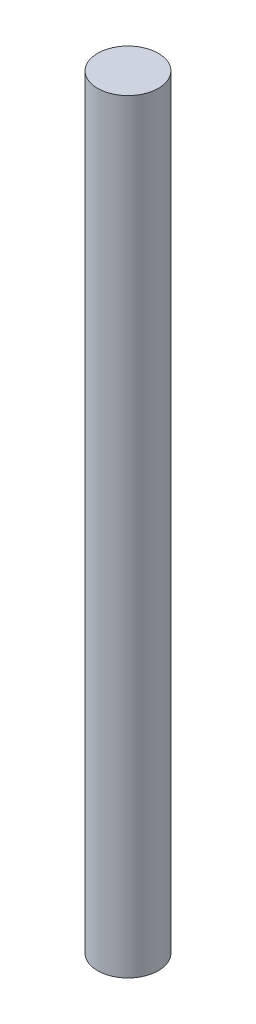
ISO-10303-21;
HEADER;
FILE_DESCRIPTION(('STEP AP214'),'2;1');
FILE_NAME('part.step','',(''),(''),'','','');
FILE_SCHEMA(('AUTOMOTIVE_DESIGN { 1 0 10303 214 1 1 1 1 }'));
ENDSEC;
DATA;
#1=APPLICATION_CONTEXT('core data for automotive mechanical design processes');
#2=APPLICATION_PROTOCOL_DEFINITION('international standard','automotive_design',2000,#1);
#3=PRODUCT_CONTEXT('',#1,'mechanical');
#4=PRODUCT('Part','Part','',(#3));
#5=PRODUCT_RELATED_PRODUCT_CATEGORY('part','',(#4));
#6=PRODUCT_DEFINITION_FORMATION('','',#4);
#7=PRODUCT_DEFINITION_CONTEXT('part definition',#1,'design');
#8=PRODUCT_DEFINITION('design','',#6,#7);
#9=PRODUCT_DEFINITION_SHAPE('','',#8);
#10=(LENGTH_UNIT() NAMED_UNIT(*) SI_UNIT(.MILLI.,.METRE.));
#11=(NAMED_UNIT(*) PLANE_ANGLE_UNIT() SI_UNIT($,.RADIAN.));
#12=(NAMED_UNIT(*) SI_UNIT($,.STERADIAN.) SOLID_ANGLE_UNIT());
#13=UNCERTAINTY_MEASURE_WITH_UNIT(LENGTH_MEASURE(1.E-05),#10,'distance_accuracy_value','');
#14=(GEOMETRIC_REPRESENTATION_CONTEXT(3) GLOBAL_UNCERTAINTY_ASSIGNED_CONTEXT((#13)) GLOBAL_UNIT_ASSIGNED_CONTEXT((#10,
#11,#12)) REPRESENTATION_CONTEXT('',''));
#15=CARTESIAN_POINT('',(0.,0.,0.));
#16=DIRECTION('',(0.,0.,1.));
#17=DIRECTION('',(1.,0.,0.));
#18=AXIS2_PLACEMENT_3D('',#15,#16,#17);
#19=CARTESIAN_POINT('',(0.,100.,0.));
#20=DIRECTION('',(0.,-1.,0.));
#21=DIRECTION('',(0.,0.,-1.));
#22=AXIS2_PLACEMENT_3D('',#19,#20,#21);
#23=CYLINDRICAL_SURFACE('',#22,3.975);
#24=CARTESIAN_POINT('',(0.,100.,0.));
#25=DIRECTION('',(0.,1.,0.));
#26=DIRECTION('',(0.,0.,1.));
#27=AXIS2_PLACEMENT_3D('',#24,#25,#26);
#28=CIRCLE('',#27,3.975);
#29=CARTESIAN_POINT('',(0.,100.,3.975));
#30=VERTEX_POINT('',#29);
#31=EDGE_CURVE('E10',#30,#30,#28,.T.);
#32=ORIENTED_EDGE('',*,*,#31,.F.);
#33=EDGE_LOOP('',(#32));
#34=FACE_BOUND('',#33,.T.);
#35=CARTESIAN_POINT('',(0.,0.,0.));
#36=DIRECTION('',(0.,1.,0.));
#37=DIRECTION('',(0.,0.,1.));
#38=AXIS2_PLACEMENT_3D('',#35,#36,#37);
#39=CIRCLE('',#38,3.975);
#40=CARTESIAN_POINT('',(0.,0.,3.975));
#41=VERTEX_POINT('',#40);
#42=EDGE_CURVE('E34',#41,#41,#39,.T.);
#43=ORIENTED_EDGE('',*,*,#42,.T.);
#44=EDGE_LOOP('',(#43));
#45=FACE_BOUND('',#44,.T.);
#46=ADVANCED_FACE('F31',(#34,#45),#23,.T.);
#47=CARTESIAN_POINT('',(0.,100.,0.));
#48=DIRECTION('',(0.,1.,0.));
#49=DIRECTION('',(0.,0.,1.));
#50=AXIS2_PLACEMENT_3D('',#47,#48,#49);
#51=PLANE('',#50);
#52=ORIENTED_EDGE('',*,*,#31,.T.);
#53=EDGE_LOOP('',(#52));
#54=FACE_BOUND('',#53,.T.);
#55=ADVANCED_FACE('F46',(#54),#51,.T.);
#56=CARTESIAN_POINT('',(0.,0.,0.));
#57=DIRECTION('',(0.,1.,0.));
#58=DIRECTION('',(0.,0.,1.));
#59=AXIS2_PLACEMENT_3D('',#56,#57,#58);
#60=PLANE('',#59);
#61=ORIENTED_EDGE('',*,*,#42,.F.);
#62=EDGE_LOOP('',(#61));
#63=FACE_BOUND('',#62,.T.);
#64=ADVANCED_FACE('F44',(#63),#60,.F.);
#65=CLOSED_SHELL('',(#46,#55,#64));
#66=MANIFOLD_SOLID_BREP('B2',#65);
#67=ADVANCED_BREP_SHAPE_REPRESENTATION('',(#18,#66),#14);
#68=SHAPE_DEFINITION_REPRESENTATION(#9,#67);
ENDSEC;
END-ISO-10303-21;
